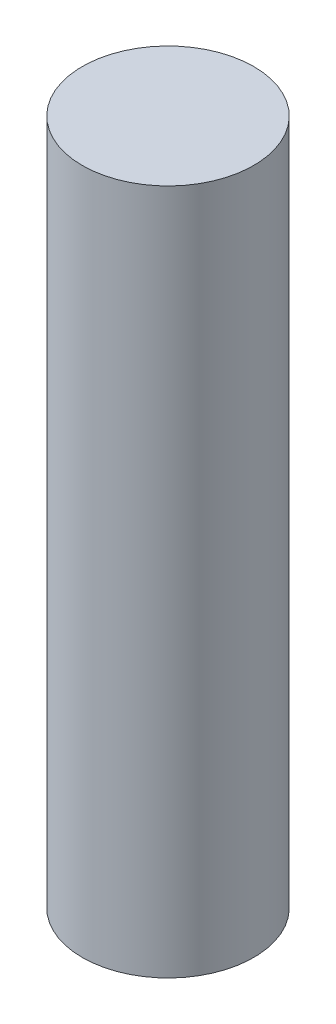
ISO-10303-21;
HEADER;
FILE_DESCRIPTION(('STEP AP214'),'2;1');
FILE_NAME('part.step','',(''),(''),'','','');
FILE_SCHEMA(('AUTOMOTIVE_DESIGN { 1 0 10303 214 1 1 1 1 }'));
ENDSEC;
DATA;
#1=APPLICATION_CONTEXT('core data for automotive mechanical design processes');
#2=APPLICATION_PROTOCOL_DEFINITION('international standard','automotive_design',2000,#1);
#3=PRODUCT_CONTEXT('',#1,'mechanical');
#4=PRODUCT('Part','Part','',(#3));
#5=PRODUCT_RELATED_PRODUCT_CATEGORY('part','',(#4));
#6=PRODUCT_DEFINITION_FORMATION('','',#4);
#7=PRODUCT_DEFINITION_CONTEXT('part definition',#1,'design');
#8=PRODUCT_DEFINITION('design','',#6,#7);
#9=PRODUCT_DEFINITION_SHAPE('','',#8);
#10=(LENGTH_UNIT() NAMED_UNIT(*) SI_UNIT(.MILLI.,.METRE.));
#11=(NAMED_UNIT(*) PLANE_ANGLE_UNIT() SI_UNIT($,.RADIAN.));
#12=(NAMED_UNIT(*) SI_UNIT($,.STERADIAN.) SOLID_ANGLE_UNIT());
#13=UNCERTAINTY_MEASURE_WITH_UNIT(LENGTH_MEASURE(1.E-05),#10,'distance_accuracy_value','');
#14=(GEOMETRIC_REPRESENTATION_CONTEXT(3) GLOBAL_UNCERTAINTY_ASSIGNED_CONTEXT((#13)) GLOBAL_UNIT_ASSIGNED_CONTEXT((#10,
#11,#12)) REPRESENTATION_CONTEXT('',''));
#15=CARTESIAN_POINT('',(0.,0.,0.));
#16=DIRECTION('',(0.,0.,1.));
#17=DIRECTION('',(1.,0.,0.));
#18=AXIS2_PLACEMENT_3D('',#15,#16,#17);
#19=CARTESIAN_POINT('',(44.45,38.1,44.45));
#20=DIRECTION('',(0.,1.,0.));
#21=DIRECTION('',(0.,0.,1.));
#22=AXIS2_PLACEMENT_3D('',#19,#20,#21);
#23=CYLINDRICAL_SURFACE('',#22,9.525);
#24=CARTESIAN_POINT('',(44.45,38.1,44.45));
#25=DIRECTION('',(0.,1.,0.));
#26=DIRECTION('',(0.,0.,1.));
#27=AXIS2_PLACEMENT_3D('',#24,#25,#26);
#28=CIRCLE('',#27,9.525);
#29=CARTESIAN_POINT('',(44.45,38.1,53.975));
#30=VERTEX_POINT('',#29);
#31=EDGE_CURVE('E10',#30,#30,#28,.T.);
#32=CARTESIAN_POINT('',(44.45,114.3,44.45));
#33=DIRECTION('',(0.,1.,0.));
#34=DIRECTION('',(0.,0.,1.));
#35=AXIS2_PLACEMENT_3D('',#32,#33,#34);
#36=CIRCLE('',#35,9.525);
#37=CARTESIAN_POINT('',(44.45,114.3,53.975));
#38=VERTEX_POINT('',#37);
#39=EDGE_CURVE('E35',#38,#38,#36,.T.);
#40=CARTESIAN_POINT('',(44.45,38.1,53.975));
#41=CARTESIAN_POINT('',(44.45,38.89375,53.975));
#42=CARTESIAN_POINT('',(44.45,39.6875,53.975));
#43=CARTESIAN_POINT('',(44.45,41.275,53.975));
#44=CARTESIAN_POINT('',(44.45,42.06875,53.975));
#45=CARTESIAN_POINT('',(44.45,43.65625,53.975));
#46=CARTESIAN_POINT('',(44.45,44.45,53.975));
#47=CARTESIAN_POINT('',(44.45,46.0375,53.975));
#48=CARTESIAN_POINT('',(44.45,46.83125,53.975));
#49=CARTESIAN_POINT('',(44.45,48.41875,53.975));
#50=CARTESIAN_POINT('',(44.45,49.2125,53.975));
#51=CARTESIAN_POINT('',(44.45,50.8,53.975));
#52=CARTESIAN_POINT('',(44.45,51.59375,53.975));
#53=CARTESIAN_POINT('',(44.45,53.18125,53.975));
#54=CARTESIAN_POINT('',(44.45,53.975,53.975));
#55=CARTESIAN_POINT('',(44.45,55.5625,53.975));
#56=CARTESIAN_POINT('',(44.45,56.35625,53.975));
#57=CARTESIAN_POINT('',(44.45,57.94375,53.975));
#58=CARTESIAN_POINT('',(44.45,58.7375,53.975));
#59=CARTESIAN_POINT('',(44.45,60.325,53.975));
#60=CARTESIAN_POINT('',(44.45,61.11875,53.975));
#61=CARTESIAN_POINT('',(44.45,62.70625,53.975));
#62=CARTESIAN_POINT('',(44.45,63.5,53.975));
#63=CARTESIAN_POINT('',(44.45,65.0875,53.975));
#64=CARTESIAN_POINT('',(44.45,65.88125,53.975));
#65=CARTESIAN_POINT('',(44.45,67.46875,53.975));
#66=CARTESIAN_POINT('',(44.45,68.2625,53.975));
#67=CARTESIAN_POINT('',(44.45,69.85,53.975));
#68=CARTESIAN_POINT('',(44.45,70.64375,53.975));
#69=CARTESIAN_POINT('',(44.45,72.23125,53.975));
#70=CARTESIAN_POINT('',(44.45,73.025,53.975));
#71=CARTESIAN_POINT('',(44.45,74.6125,53.975));
#72=CARTESIAN_POINT('',(44.45,75.40625,53.975));
#73=CARTESIAN_POINT('',(44.45,76.99375,53.975));
#74=CARTESIAN_POINT('',(44.45,77.7875,53.975));
#75=CARTESIAN_POINT('',(44.45,79.375,53.975));
#76=CARTESIAN_POINT('',(44.45,80.16875,53.975));
#77=CARTESIAN_POINT('',(44.45,81.75625,53.975));
#78=CARTESIAN_POINT('',(44.45,82.55,53.975));
#79=CARTESIAN_POINT('',(44.45,84.1375,53.975));
#80=CARTESIAN_POINT('',(44.45,84.93125,53.975));
#81=CARTESIAN_POINT('',(44.45,86.51875,53.975));
#82=CARTESIAN_POINT('',(44.45,87.3125,53.975));
#83=CARTESIAN_POINT('',(44.45,88.9,53.975));
#84=CARTESIAN_POINT('',(44.45,89.69375,53.975));
#85=CARTESIAN_POINT('',(44.45,91.28125,53.975));
#86=CARTESIAN_POINT('',(44.45,92.075,53.975));
#87=CARTESIAN_POINT('',(44.45,93.6625,53.975));
#88=CARTESIAN_POINT('',(44.45,94.45625,53.975));
#89=CARTESIAN_POINT('',(44.45,96.04375,53.975));
#90=CARTESIAN_POINT('',(44.45,96.8375,53.975));
#91=CARTESIAN_POINT('',(44.45,98.425,53.975));
#92=CARTESIAN_POINT('',(44.45,99.21875,53.975));
#93=CARTESIAN_POINT('',(44.45,100.80625,53.975));
#94=CARTESIAN_POINT('',(44.45,101.6,53.975));
#95=CARTESIAN_POINT('',(44.45,103.1875,53.975));
#96=CARTESIAN_POINT('',(44.45,103.98125,53.975));
#97=CARTESIAN_POINT('',(44.45,105.56875,53.975));
#98=CARTESIAN_POINT('',(44.45,106.3625,53.975));
#99=CARTESIAN_POINT('',(44.45,107.95,53.975));
#100=CARTESIAN_POINT('',(44.45,108.74375,53.975));
#101=CARTESIAN_POINT('',(44.45,110.33125,53.975));
#102=CARTESIAN_POINT('',(44.45,111.125,53.975));
#103=CARTESIAN_POINT('',(44.45,112.7125,53.975));
#104=CARTESIAN_POINT('',(44.45,113.50625,53.975));
#105=CARTESIAN_POINT('',(44.45,114.3,53.975));
#106=B_SPLINE_CURVE_WITH_KNOTS('',3,(#40,#41,#42,#43,#44,#45,#46,#47,#48,#49,#50,#51,#52,#53,
#54,#55,#56,#57,#58,#59,#60,#61,#62,#63,#64,#65,#66,#67,#68,#69,#70,#71,#72,#73,#74,#75,#76,#77,
#78,#79,#80,#81,#82,#83,#84,#85,#86,#87,#88,#89,#90,#91,#92,#93,#94,#95,#96,#97,#98,#99,#100,
#101,#102,#103,#104,#105),.UNSPECIFIED.,.F.,.F.,(4,2,2,2,2,2,2,2,2,2,2,2,2,2,2,2,2,2,2,2,2,2,2,
2,2,2,2,2,2,2,2,2,4),(0.,2.38124999999999,4.7625,7.14375,9.525,11.90625,14.2875,16.66875,19.05,
21.43125,23.8125,26.19375,28.575,30.95625,33.3375,35.71875,38.1,40.48125,42.8625,45.24375,
47.625,50.00625,52.3875,54.76875,57.15,59.53125,61.9125,64.29375,66.675,69.05625,71.4375,
73.81875,76.2),.UNSPECIFIED.);
#107=EDGE_CURVE('BSEAM29',#30,#38,#106,.T.);
#108=ORIENTED_EDGE('',*,*,#31,.T.);
#109=ORIENTED_EDGE('',*,*,#39,.F.);
#110=ORIENTED_EDGE('',*,*,#107,.T.);
#111=ORIENTED_EDGE('',*,*,#107,.F.);
#112=EDGE_LOOP('',(#108,#110,#109,#111));
#113=FACE_BOUND('',#112,.T.);
#114=ADVANCED_FACE('F29',(#113),#23,.T.);
#115=CARTESIAN_POINT('',(44.45,38.1,44.45));
#116=DIRECTION('',(0.,1.,0.));
#117=DIRECTION('',(0.,0.,1.));
#118=AXIS2_PLACEMENT_3D('',#115,#116,#117);
#119=PLANE('',#118);
#120=ORIENTED_EDGE('',*,*,#31,.F.);
#121=EDGE_LOOP('',(#120));
#122=FACE_BOUND('',#121,.T.);
#123=ADVANCED_FACE('F44',(#122),#119,.F.);
#124=CARTESIAN_POINT('',(44.45,114.3,44.45));
#125=DIRECTION('',(0.,1.,0.));
#126=DIRECTION('',(0.,0.,1.));
#127=AXIS2_PLACEMENT_3D('',#124,#125,#126);
#128=PLANE('',#127);
#129=ORIENTED_EDGE('',*,*,#39,.T.);
#130=EDGE_LOOP('',(#129));
#131=FACE_BOUND('',#130,.T.);
#132=ADVANCED_FACE('F41',(#131),#128,.T.);
#133=CLOSED_SHELL('',(#114,#123,#132));
#134=MANIFOLD_SOLID_BREP('B2',#133);
#135=ADVANCED_BREP_SHAPE_REPRESENTATION('',(#18,#134),#14);
#136=SHAPE_DEFINITION_REPRESENTATION(#9,#135);
ENDSEC;
END-ISO-10303-21;
